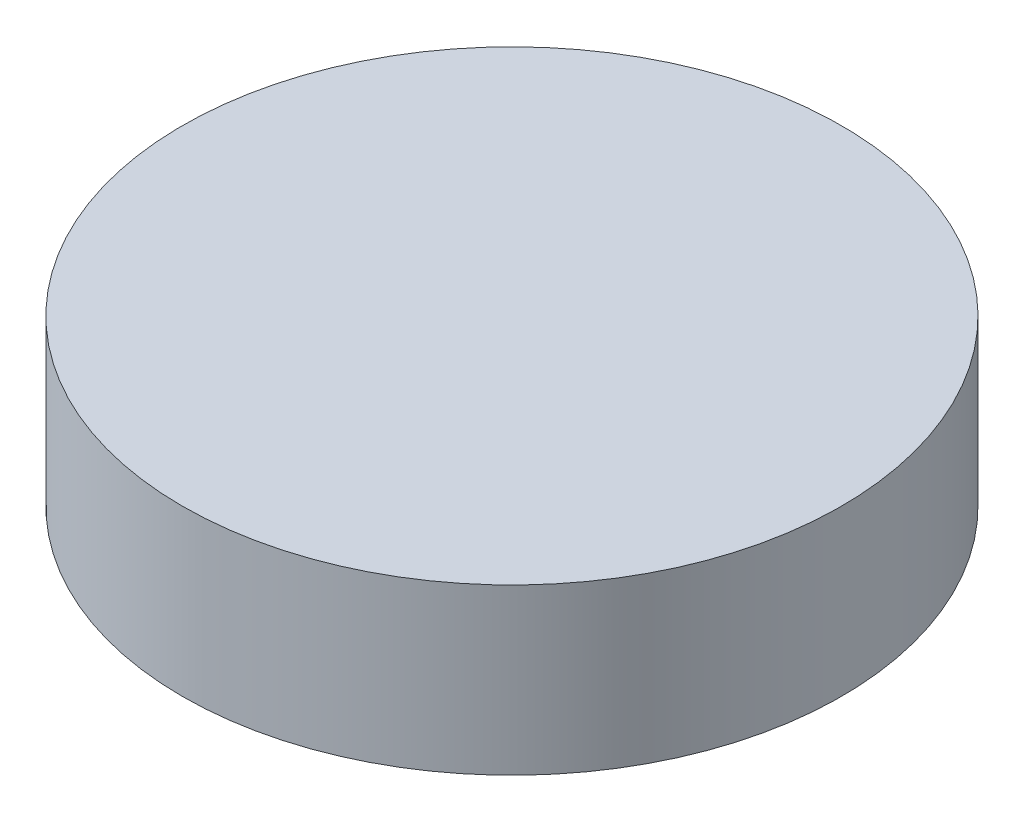
ISO-10303-21;
HEADER;
FILE_DESCRIPTION(('STEP AP214'),'2;1');
FILE_NAME('part.step','',(''),(''),'','','');
FILE_SCHEMA(('AUTOMOTIVE_DESIGN { 1 0 10303 214 1 1 1 1 }'));
ENDSEC;
DATA;
#1=APPLICATION_CONTEXT('core data for automotive mechanical design processes');
#2=APPLICATION_PROTOCOL_DEFINITION('international standard','automotive_design',2000,#1);
#3=PRODUCT_CONTEXT('',#1,'mechanical');
#4=PRODUCT('Part','Part','',(#3));
#5=PRODUCT_RELATED_PRODUCT_CATEGORY('part','',(#4));
#6=PRODUCT_DEFINITION_FORMATION('','',#4);
#7=PRODUCT_DEFINITION_CONTEXT('part definition',#1,'design');
#8=PRODUCT_DEFINITION('design','',#6,#7);
#9=PRODUCT_DEFINITION_SHAPE('','',#8);
#10=(LENGTH_UNIT() NAMED_UNIT(*) SI_UNIT(.MILLI.,.METRE.));
#11=(NAMED_UNIT(*) PLANE_ANGLE_UNIT() SI_UNIT($,.RADIAN.));
#12=(NAMED_UNIT(*) SI_UNIT($,.STERADIAN.) SOLID_ANGLE_UNIT());
#13=UNCERTAINTY_MEASURE_WITH_UNIT(LENGTH_MEASURE(1.E-05),#10,'distance_accuracy_value','');
#14=(GEOMETRIC_REPRESENTATION_CONTEXT(3) GLOBAL_UNCERTAINTY_ASSIGNED_CONTEXT((#13)) GLOBAL_UNIT_ASSIGNED_CONTEXT((#10,
#11,#12)) REPRESENTATION_CONTEXT('',''));
#15=CARTESIAN_POINT('',(0.,0.,0.));
#16=DIRECTION('',(0.,0.,1.));
#17=DIRECTION('',(1.,0.,0.));
#18=AXIS2_PLACEMENT_3D('',#15,#16,#17);
#19=CARTESIAN_POINT('',(0.,3.175,0.));
#20=DIRECTION('',(0.,-1.,0.));
#21=DIRECTION('',(0.,0.,-1.));
#22=AXIS2_PLACEMENT_3D('',#19,#20,#21);
#23=CYLINDRICAL_SURFACE('',#22,6.35);
#24=CARTESIAN_POINT('',(0.,3.175,0.));
#25=DIRECTION('',(0.,1.,0.));
#26=DIRECTION('',(0.,0.,1.));
#27=AXIS2_PLACEMENT_3D('',#24,#25,#26);
#28=CIRCLE('',#27,6.35);
#29=CARTESIAN_POINT('',(0.,3.175,6.35));
#30=VERTEX_POINT('',#29);
#31=EDGE_CURVE('E10',#30,#30,#28,.T.);
#32=ORIENTED_EDGE('',*,*,#31,.F.);
#33=EDGE_LOOP('',(#32));
#34=FACE_BOUND('',#33,.T.);
#35=CARTESIAN_POINT('',(0.,0.,0.));
#36=DIRECTION('',(0.,1.,0.));
#37=DIRECTION('',(0.,0.,1.));
#38=AXIS2_PLACEMENT_3D('',#35,#36,#37);
#39=CIRCLE('',#38,6.35);
#40=CARTESIAN_POINT('',(0.,0.,6.35));
#41=VERTEX_POINT('',#40);
#42=EDGE_CURVE('E40',#41,#41,#39,.T.);
#43=ORIENTED_EDGE('',*,*,#42,.T.);
#44=EDGE_LOOP('',(#43));
#45=FACE_BOUND('',#44,.T.);
#46=ADVANCED_FACE('F37',(#34,#45),#23,.T.);
#47=CARTESIAN_POINT('',(0.,3.175,0.));
#48=DIRECTION('',(0.,1.,0.));
#49=DIRECTION('',(0.,0.,1.));
#50=AXIS2_PLACEMENT_3D('',#47,#48,#49);
#51=PLANE('',#50);
#52=ORIENTED_EDGE('',*,*,#31,.T.);
#53=EDGE_LOOP('',(#52));
#54=FACE_BOUND('',#53,.T.);
#55=ADVANCED_FACE('F52',(#54),#51,.T.);
#56=CARTESIAN_POINT('',(0.,0.,0.));
#57=DIRECTION('',(0.,1.,0.));
#58=DIRECTION('',(0.,0.,1.));
#59=AXIS2_PLACEMENT_3D('',#56,#57,#58);
#60=PLANE('',#59);
#61=ORIENTED_EDGE('',*,*,#42,.F.);
#62=EDGE_LOOP('',(#61));
#63=FACE_BOUND('',#62,.T.);
#64=ADVANCED_FACE('F50',(#63),#60,.F.);
#65=CLOSED_SHELL('',(#46,#55,#64));
#66=MANIFOLD_SOLID_BREP('B2',#65);
#67=ADVANCED_BREP_SHAPE_REPRESENTATION('',(#18,#66),#14);
#68=SHAPE_DEFINITION_REPRESENTATION(#9,#67);
ENDSEC;
END-ISO-10303-21;
